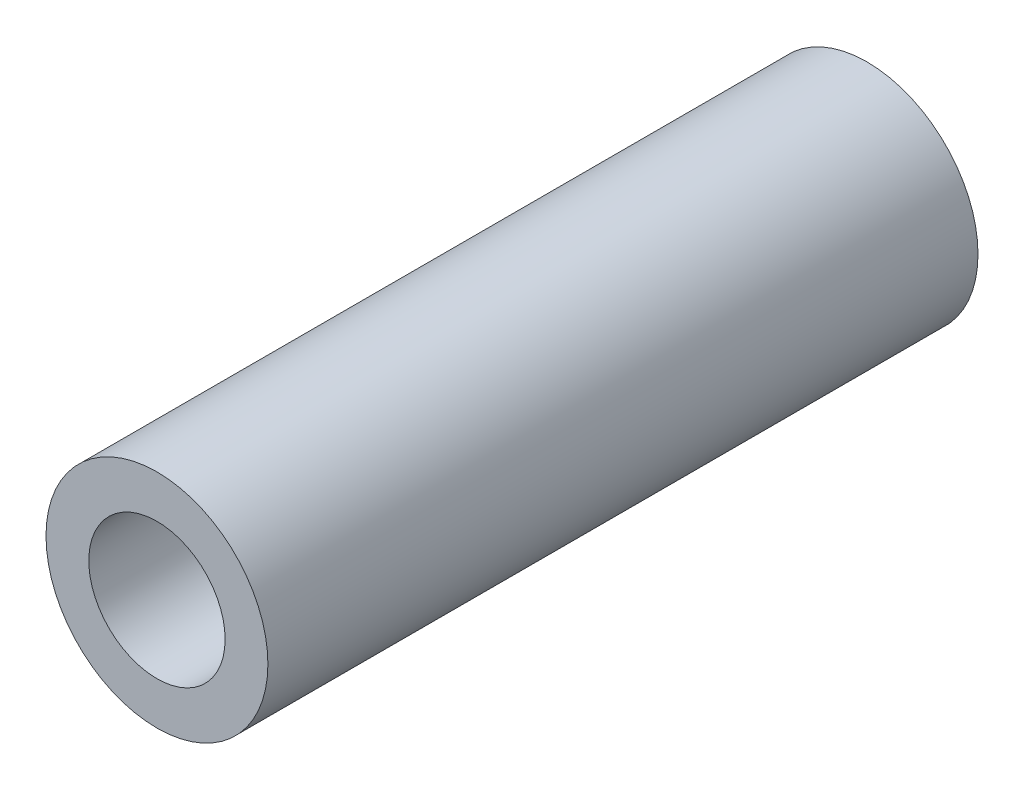
ISO-10303-21;
HEADER;
FILE_DESCRIPTION(('STEP AP214'),'2;1');
FILE_NAME('part.step','',(''),(''),'','','');
FILE_SCHEMA(('AUTOMOTIVE_DESIGN { 1 0 10303 214 1 1 1 1 }'));
ENDSEC;
DATA;
#1=APPLICATION_CONTEXT('core data for automotive mechanical design processes');
#2=APPLICATION_PROTOCOL_DEFINITION('international standard','automotive_design',2000,#1);
#3=PRODUCT_CONTEXT('',#1,'mechanical');
#4=PRODUCT('Part','Part','',(#3));
#5=PRODUCT_RELATED_PRODUCT_CATEGORY('part','',(#4));
#6=PRODUCT_DEFINITION_FORMATION('','',#4);
#7=PRODUCT_DEFINITION_CONTEXT('part definition',#1,'design');
#8=PRODUCT_DEFINITION('design','',#6,#7);
#9=PRODUCT_DEFINITION_SHAPE('','',#8);
#10=(LENGTH_UNIT() NAMED_UNIT(*) SI_UNIT(.MILLI.,.METRE.));
#11=(NAMED_UNIT(*) PLANE_ANGLE_UNIT() SI_UNIT($,.RADIAN.));
#12=(NAMED_UNIT(*) SI_UNIT($,.STERADIAN.) SOLID_ANGLE_UNIT());
#13=UNCERTAINTY_MEASURE_WITH_UNIT(LENGTH_MEASURE(1.E-05),#10,'distance_accuracy_value','');
#14=(GEOMETRIC_REPRESENTATION_CONTEXT(3) GLOBAL_UNCERTAINTY_ASSIGNED_CONTEXT((#13)) GLOBAL_UNIT_ASSIGNED_CONTEXT((#10,
#11,#12)) REPRESENTATION_CONTEXT('',''));
#15=CARTESIAN_POINT('',(0.,0.,0.));
#16=DIRECTION('',(0.,0.,1.));
#17=DIRECTION('',(1.,0.,0.));
#18=AXIS2_PLACEMENT_3D('',#15,#16,#17);
#19=CARTESIAN_POINT('',(0.,0.,12.7));
#20=DIRECTION('',(0.,0.,1.));
#21=DIRECTION('',(1.,0.,0.));
#22=AXIS2_PLACEMENT_3D('',#19,#20,#21);
#23=PLANE('',#22);
#24=CARTESIAN_POINT('',(0.,0.,12.7));
#25=DIRECTION('',(0.,0.,1.));
#26=DIRECTION('',(1.,0.,0.));
#27=AXIS2_PLACEMENT_3D('',#24,#25,#26);
#28=CIRCLE('',#27,3.96875);
#29=CARTESIAN_POINT('',(3.96875,0.,12.7));
#30=VERTEX_POINT('',#29);
#31=EDGE_CURVE('E10',#30,#30,#28,.T.);
#32=ORIENTED_EDGE('',*,*,#31,.T.);
#33=EDGE_LOOP('',(#32));
#34=FACE_BOUND('',#33,.T.);
#35=CARTESIAN_POINT('',(0.,0.,12.7));
#36=DIRECTION('',(0.,0.,1.));
#37=DIRECTION('',(1.,0.,0.));
#38=AXIS2_PLACEMENT_3D('',#35,#36,#37);
#39=CIRCLE('',#38,2.4384);
#40=CARTESIAN_POINT('',(2.4384,0.,12.7));
#41=VERTEX_POINT('',#40);
#42=EDGE_CURVE('E41',#41,#41,#39,.T.);
#43=ORIENTED_EDGE('',*,*,#42,.F.);
#44=EDGE_LOOP('',(#43));
#45=FACE_BOUND('',#44,.T.);
#46=ADVANCED_FACE('F30',(#34,#45),#23,.T.);
#47=CARTESIAN_POINT('',(0.,0.,-12.7));
#48=DIRECTION('',(0.,0.,1.));
#49=DIRECTION('',(1.,0.,0.));
#50=AXIS2_PLACEMENT_3D('',#47,#48,#49);
#51=PLANE('',#50);
#52=CARTESIAN_POINT('',(0.,0.,-12.7));
#53=DIRECTION('',(0.,0.,1.));
#54=DIRECTION('',(1.,0.,0.));
#55=AXIS2_PLACEMENT_3D('',#52,#53,#54);
#56=CIRCLE('',#55,3.96875);
#57=CARTESIAN_POINT('',(3.96875,0.,-12.7));
#58=VERTEX_POINT('',#57);
#59=EDGE_CURVE('E34',#58,#58,#56,.T.);
#60=ORIENTED_EDGE('',*,*,#59,.F.);
#61=EDGE_LOOP('',(#60));
#62=FACE_BOUND('',#61,.T.);
#63=CARTESIAN_POINT('',(0.,0.,-12.7));
#64=DIRECTION('',(0.,0.,1.));
#65=DIRECTION('',(1.,0.,0.));
#66=AXIS2_PLACEMENT_3D('',#63,#64,#65);
#67=CIRCLE('',#66,2.4384);
#68=CARTESIAN_POINT('',(2.4384,0.,-12.7));
#69=VERTEX_POINT('',#68);
#70=EDGE_CURVE('E43',#69,#69,#67,.T.);
#71=ORIENTED_EDGE('',*,*,#70,.T.);
#72=EDGE_LOOP('',(#71));
#73=FACE_BOUND('',#72,.T.);
#74=ADVANCED_FACE('F53',(#62,#73),#51,.F.);
#75=CARTESIAN_POINT('',(0.,0.,12.7));
#76=DIRECTION('',(0.,0.,-1.));
#77=DIRECTION('',(-1.,0.,0.));
#78=AXIS2_PLACEMENT_3D('',#75,#76,#77);
#79=CYLINDRICAL_SURFACE('',#78,3.96875);
#80=ORIENTED_EDGE('',*,*,#31,.F.);
#81=EDGE_LOOP('',(#80));
#82=FACE_BOUND('',#81,.T.);
#83=ORIENTED_EDGE('',*,*,#59,.T.);
#84=EDGE_LOOP('',(#83));
#85=FACE_BOUND('',#84,.T.);
#86=ADVANCED_FACE('F32',(#82,#85),#79,.T.);
#87=CARTESIAN_POINT('',(0.,0.,12.7));
#88=DIRECTION('',(0.,0.,-1.));
#89=DIRECTION('',(-1.,0.,0.));
#90=AXIS2_PLACEMENT_3D('',#87,#88,#89);
#91=CYLINDRICAL_SURFACE('',#90,2.4384);
#92=ORIENTED_EDGE('',*,*,#42,.T.);
#93=EDGE_LOOP('',(#92));
#94=FACE_BOUND('',#93,.T.);
#95=ORIENTED_EDGE('',*,*,#70,.F.);
#96=EDGE_LOOP('',(#95));
#97=FACE_BOUND('',#96,.T.);
#98=ADVANCED_FACE('F49',(#94,#97),#91,.F.);
#99=CLOSED_SHELL('',(#46,#74,#86,#98));
#100=MANIFOLD_SOLID_BREP('B2',#99);
#101=ADVANCED_BREP_SHAPE_REPRESENTATION('',(#18,#100),#14);
#102=SHAPE_DEFINITION_REPRESENTATION(#9,#101);
ENDSEC;
END-ISO-10303-21;
